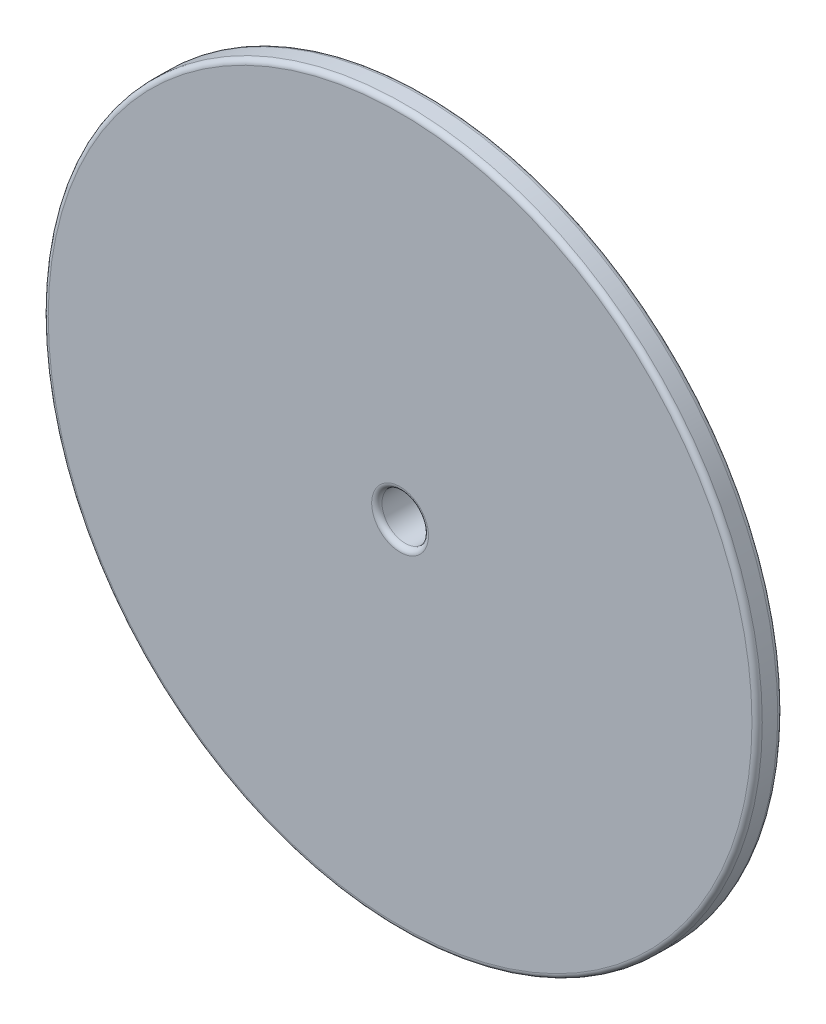
ISO-10303-21;
HEADER;
FILE_DESCRIPTION(('STEP AP214'),'2;1');
FILE_NAME('part.step','',(''),(''),'','','');
FILE_SCHEMA(('AUTOMOTIVE_DESIGN { 1 0 10303 214 1 1 1 1 }'));
ENDSEC;
DATA;
#1=APPLICATION_CONTEXT('core data for automotive mechanical design processes');
#2=APPLICATION_PROTOCOL_DEFINITION('international standard','automotive_design',2000,#1);
#3=PRODUCT_CONTEXT('',#1,'mechanical');
#4=PRODUCT('Part','Part','',(#3));
#5=PRODUCT_RELATED_PRODUCT_CATEGORY('part','',(#4));
#6=PRODUCT_DEFINITION_FORMATION('','',#4);
#7=PRODUCT_DEFINITION_CONTEXT('part definition',#1,'design');
#8=PRODUCT_DEFINITION('design','',#6,#7);
#9=PRODUCT_DEFINITION_SHAPE('','',#8);
#10=(LENGTH_UNIT() NAMED_UNIT(*) SI_UNIT(.MILLI.,.METRE.));
#11=(NAMED_UNIT(*) PLANE_ANGLE_UNIT() SI_UNIT($,.RADIAN.));
#12=(NAMED_UNIT(*) SI_UNIT($,.STERADIAN.) SOLID_ANGLE_UNIT());
#13=UNCERTAINTY_MEASURE_WITH_UNIT(LENGTH_MEASURE(1.E-05),#10,'distance_accuracy_value','');
#14=(GEOMETRIC_REPRESENTATION_CONTEXT(3) GLOBAL_UNCERTAINTY_ASSIGNED_CONTEXT((#13)) GLOBAL_UNIT_ASSIGNED_CONTEXT((#10,
#11,#12)) REPRESENTATION_CONTEXT('',''));
#15=CARTESIAN_POINT('',(0.,0.,0.));
#16=DIRECTION('',(0.,0.,1.));
#17=DIRECTION('',(1.,0.,0.));
#18=AXIS2_PLACEMENT_3D('',#15,#16,#17);
#19=CARTESIAN_POINT('',(18.311201493868,38.837909892891,53.9532119514337));
#20=DIRECTION('',(0.,0.,1.));
#21=DIRECTION('',(1.,0.,0.));
#22=AXIS2_PLACEMENT_3D('',#19,#20,#21);
#23=PLANE('',#22);
#24=CARTESIAN_POINT('',(18.311201493868,38.837909892891,53.9532119514337));
#25=DIRECTION('',(0.,0.,1.));
#26=DIRECTION('',(1.,0.,0.));
#27=AXIS2_PLACEMENT_3D('',#24,#25,#26);
#28=CIRCLE('',#27,2.75);
#29=CARTESIAN_POINT('',(21.061201493868,38.837909892891,53.9532119514337));
#30=VERTEX_POINT('',#29);
#31=EDGE_CURVE('E61',#30,#30,#28,.F.);
#32=ORIENTED_EDGE('',*,*,#31,.T.);
#33=EDGE_LOOP('',(#32));
#34=FACE_BOUND('',#33,.T.);
#35=CARTESIAN_POINT('',(18.311201493868,38.837909892891,53.9532119514337));
#36=DIRECTION('',(0.,0.,1.));
#37=DIRECTION('',(1.,0.,0.));
#38=AXIS2_PLACEMENT_3D('',#35,#36,#37);
#39=CIRCLE('',#38,34.0756536779814);
#40=CARTESIAN_POINT('',(52.3868551718495,38.837909892891,53.9532119514337));
#41=VERTEX_POINT('',#40);
#42=EDGE_CURVE('E64',#41,#41,#39,.T.);
#43=ORIENTED_EDGE('',*,*,#42,.T.);
#44=EDGE_LOOP('',(#43));
#45=FACE_BOUND('',#44,.T.);
#46=ADVANCED_FACE('F35',(#34,#45),#23,.T.);
#47=CARTESIAN_POINT('',(18.311201493868,38.837909892891,45.9532119514337));
#48=DIRECTION('',(0.,0.,-1.));
#49=DIRECTION('',(-1.,0.,0.));
#50=AXIS2_PLACEMENT_3D('',#47,#48,#49);
#51=CYLINDRICAL_SURFACE('',#50,2.25);
#52=CARTESIAN_POINT('',(18.311201493868,38.837909892891,53.4532119514337));
#53=DIRECTION('',(0.,0.,1.));
#54=DIRECTION('',(1.,0.,0.));
#55=AXIS2_PLACEMENT_3D('',#52,#53,#54);
#56=CIRCLE('',#55,2.25);
#57=CARTESIAN_POINT('',(20.561201493868,38.837909892891,53.4532119514337));
#58=VERTEX_POINT('',#57);
#59=EDGE_CURVE('E67',#58,#58,#56,.T.);
#60=ORIENTED_EDGE('',*,*,#59,.T.);
#61=EDGE_LOOP('',(#60));
#62=FACE_BOUND('',#61,.T.);
#63=CARTESIAN_POINT('',(18.311201493868,38.837909892891,49.6532119514337));
#64=DIRECTION('',(0.,0.,-1.));
#65=DIRECTION('',(-1.,0.,0.));
#66=AXIS2_PLACEMENT_3D('',#63,#64,#65);
#67=CIRCLE('',#66,2.25);
#68=CARTESIAN_POINT('',(16.061201493868,38.837909892891,49.6532119514337));
#69=VERTEX_POINT('',#68);
#70=EDGE_CURVE('E70',#69,#69,#67,.T.);
#71=ORIENTED_EDGE('',*,*,#70,.T.);
#72=EDGE_LOOP('',(#71));
#73=FACE_BOUND('',#72,.T.);
#74=ADVANCED_FACE('F74',(#62,#73),#51,.F.);
#75=CARTESIAN_POINT('',(18.311201493868,38.837909892891,53.9532119514337));
#76=DIRECTION('',(0.,0.,-1.));
#77=DIRECTION('',(-1.,0.,0.));
#78=AXIS2_PLACEMENT_3D('',#75,#76,#77);
#79=CYLINDRICAL_SURFACE('',#78,34.5756536779814);
#80=CARTESIAN_POINT('',(18.311201493868,38.837909892891,51.9532119514337));
#81=DIRECTION('',(0.,0.,1.));
#82=DIRECTION('',(1.,0.,0.));
#83=AXIS2_PLACEMENT_3D('',#80,#81,#82);
#84=CIRCLE('',#83,34.5756536779814);
#85=CARTESIAN_POINT('',(52.8868551718495,38.837909892891,51.9532119514337));
#86=VERTEX_POINT('',#85);
#87=EDGE_CURVE('E50',#86,#86,#84,.T.);
#88=ORIENTED_EDGE('',*,*,#87,.T.);
#89=EDGE_LOOP('',(#88));
#90=FACE_BOUND('',#89,.T.);
#91=CARTESIAN_POINT('',(18.311201493868,38.837909892891,53.4532119514337));
#92=DIRECTION('',(0.,0.,1.));
#93=DIRECTION('',(1.,0.,0.));
#94=AXIS2_PLACEMENT_3D('',#91,#92,#93);
#95=CIRCLE('',#94,34.5756536779814);
#96=CARTESIAN_POINT('',(52.8868551718495,38.837909892891,53.4532119514337));
#97=VERTEX_POINT('',#96);
#98=EDGE_CURVE('E55',#97,#97,#95,.F.);
#99=ORIENTED_EDGE('',*,*,#98,.T.);
#100=EDGE_LOOP('',(#99));
#101=FACE_BOUND('',#100,.T.);
#102=ADVANCED_FACE('F94',(#90,#101),#79,.T.);
#103=CARTESIAN_POINT('',(18.311201493868,38.837909892891,51.4532119514337));
#104=DIRECTION('',(0.,0.,1.));
#105=DIRECTION('',(1.,0.,0.));
#106=AXIS2_PLACEMENT_3D('',#103,#104,#105);
#107=PLANE('',#106);
#108=CARTESIAN_POINT('',(18.311201493868,38.837909892891,51.4532119514337));
#109=DIRECTION('',(0.,0.,1.));
#110=DIRECTION('',(1.,0.,0.));
#111=AXIS2_PLACEMENT_3D('',#108,#109,#110);
#112=CIRCLE('',#111,17.5);
#113=CARTESIAN_POINT('',(35.811201493868,38.837909892891,51.4532119514337));
#114=VERTEX_POINT('',#113);
#115=EDGE_CURVE('E46',#114,#114,#112,.F.);
#116=ORIENTED_EDGE('',*,*,#115,.F.);
#117=EDGE_LOOP('',(#116));
#118=FACE_BOUND('',#117,.T.);
#119=CARTESIAN_POINT('',(18.311201493868,38.837909892891,51.4532119514337));
#120=DIRECTION('',(0.,0.,1.));
#121=DIRECTION('',(1.,0.,0.));
#122=AXIS2_PLACEMENT_3D('',#119,#120,#121);
#123=CIRCLE('',#122,34.0756536779814);
#124=CARTESIAN_POINT('',(52.3868551718495,38.837909892891,51.4532119514337));
#125=VERTEX_POINT('',#124);
#126=EDGE_CURVE('E58',#125,#125,#123,.F.);
#127=ORIENTED_EDGE('',*,*,#126,.T.);
#128=EDGE_LOOP('',(#127));
#129=FACE_BOUND('',#128,.T.);
#130=ADVANCED_FACE('F100',(#118,#129),#107,.F.);
#131=CARTESIAN_POINT('',(18.311201493868,38.837909892891,53.4532119514337));
#132=DIRECTION('',(0.,0.,1.));
#133=DIRECTION('',(1.,0.,0.));
#134=AXIS2_PLACEMENT_3D('',#131,#132,#133);
#135=TOROIDAL_SURFACE('',#134,2.75,0.5);
#136=ORIENTED_EDGE('',*,*,#31,.F.);
#137=EDGE_LOOP('',(#136));
#138=FACE_BOUND('',#137,.T.);
#139=ORIENTED_EDGE('',*,*,#59,.F.);
#140=EDGE_LOOP('',(#139));
#141=FACE_BOUND('',#140,.T.);
#142=ADVANCED_FACE('F103',(#138,#141),#135,.T.);
#143=CARTESIAN_POINT('',(18.311201493868,38.837909892891,51.9532119514337));
#144=DIRECTION('',(0.,0.,1.));
#145=DIRECTION('',(1.,0.,0.));
#146=AXIS2_PLACEMENT_3D('',#143,#144,#145);
#147=TOROIDAL_SURFACE('',#146,34.0756536779814,0.5);
#148=ORIENTED_EDGE('',*,*,#87,.F.);
#149=EDGE_LOOP('',(#148));
#150=FACE_BOUND('',#149,.T.);
#151=ORIENTED_EDGE('',*,*,#126,.F.);
#152=EDGE_LOOP('',(#151));
#153=FACE_BOUND('',#152,.T.);
#154=ADVANCED_FACE('F107',(#150,#153),#147,.T.);
#155=CARTESIAN_POINT('',(18.311201493868,38.837909892891,53.4532119514337));
#156=DIRECTION('',(0.,0.,1.));
#157=DIRECTION('',(1.,0.,0.));
#158=AXIS2_PLACEMENT_3D('',#155,#156,#157);
#159=TOROIDAL_SURFACE('',#158,34.0756536779814,0.5);
#160=ORIENTED_EDGE('',*,*,#98,.F.);
#161=EDGE_LOOP('',(#160));
#162=FACE_BOUND('',#161,.T.);
#163=ORIENTED_EDGE('',*,*,#42,.F.);
#164=EDGE_LOOP('',(#163));
#165=FACE_BOUND('',#164,.T.);
#166=ADVANCED_FACE('F85',(#162,#165),#159,.T.);
#167=CARTESIAN_POINT('',(18.311201493868,38.837909892891,49.6532119514337));
#168=DIRECTION('',(0.,0.,1.));
#169=DIRECTION('',(1.,0.,0.));
#170=AXIS2_PLACEMENT_3D('',#167,#168,#169);
#171=CYLINDRICAL_SURFACE('',#170,17.5);
#172=CARTESIAN_POINT('',(18.311201493868,38.837909892891,50.1532119514337));
#173=DIRECTION('',(0.,0.,-1.));
#174=DIRECTION('',(-1.,0.,0.));
#175=AXIS2_PLACEMENT_3D('',#172,#173,#174);
#176=CIRCLE('',#175,17.5);
#177=CARTESIAN_POINT('',(0.811201493868034,38.837909892891,50.1532119514337));
#178=VERTEX_POINT('',#177);
#179=EDGE_CURVE('E10',#178,#178,#176,.F.);
#180=ORIENTED_EDGE('',*,*,#179,.T.);
#181=EDGE_LOOP('',(#180));
#182=FACE_BOUND('',#181,.T.);
#183=ORIENTED_EDGE('',*,*,#115,.T.);
#184=EDGE_LOOP('',(#183));
#185=FACE_BOUND('',#184,.T.);
#186=ADVANCED_FACE('F78',(#182,#185),#171,.T.);
#187=CARTESIAN_POINT('',(0.,0.,49.6532119514337));
#188=DIRECTION('',(0.,0.,-1.));
#189=DIRECTION('',(-1.,0.,0.));
#190=AXIS2_PLACEMENT_3D('',#187,#188,#189);
#191=PLANE('',#190);
#192=CARTESIAN_POINT('',(18.311201493868,38.837909892891,49.6532119514337));
#193=DIRECTION('',(0.,0.,-1.));
#194=DIRECTION('',(-1.,0.,0.));
#195=AXIS2_PLACEMENT_3D('',#192,#193,#194);
#196=CIRCLE('',#195,17.);
#197=CARTESIAN_POINT('',(1.31120149386803,38.837909892891,49.6532119514337));
#198=VERTEX_POINT('',#197);
#199=EDGE_CURVE('E42',#198,#198,#196,.T.);
#200=ORIENTED_EDGE('',*,*,#199,.T.);
#201=EDGE_LOOP('',(#200));
#202=FACE_BOUND('',#201,.T.);
#203=ORIENTED_EDGE('',*,*,#70,.F.);
#204=EDGE_LOOP('',(#203));
#205=FACE_BOUND('',#204,.T.);
#206=ADVANCED_FACE('F76',(#202,#205),#191,.T.);
#207=CARTESIAN_POINT('',(18.311201493868,38.837909892891,50.1532119514337));
#208=DIRECTION('',(0.,0.,-1.));
#209=DIRECTION('',(-1.,0.,0.));
#210=AXIS2_PLACEMENT_3D('',#207,#208,#209);
#211=TOROIDAL_SURFACE('',#210,17.,0.5);
#212=ORIENTED_EDGE('',*,*,#179,.F.);
#213=EDGE_LOOP('',(#212));
#214=FACE_BOUND('',#213,.T.);
#215=ORIENTED_EDGE('',*,*,#199,.F.);
#216=EDGE_LOOP('',(#215));
#217=FACE_BOUND('',#216,.T.);
#218=ADVANCED_FACE('F37',(#214,#217),#211,.T.);
#219=CLOSED_SHELL('',(#46,#74,#102,#130,#142,#154,#166,#186,#206,#218));
#220=MANIFOLD_SOLID_BREP('B2',#219);
#221=ADVANCED_BREP_SHAPE_REPRESENTATION('',(#18,#220),#14);
#222=SHAPE_DEFINITION_REPRESENTATION(#9,#221);
ENDSEC;
END-ISO-10303-21;
